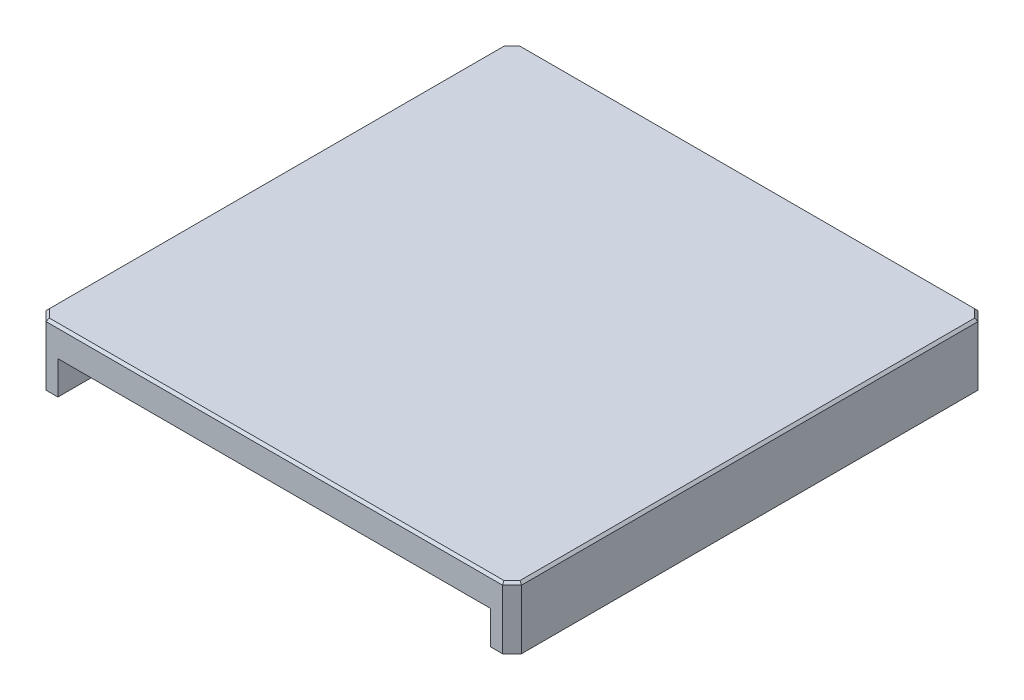
ISO-10303-21;
HEADER;
FILE_DESCRIPTION(('STEP AP214'),'2;1');
FILE_NAME('part.step','',(''),(''),'','','');
FILE_SCHEMA(('AUTOMOTIVE_DESIGN { 1 0 10303 214 1 1 1 1 }'));
ENDSEC;
DATA;
#1=APPLICATION_CONTEXT('core data for automotive mechanical design processes');
#2=APPLICATION_PROTOCOL_DEFINITION('international standard','automotive_design',2000,#1);
#3=PRODUCT_CONTEXT('',#1,'mechanical');
#4=PRODUCT('Part','Part','',(#3));
#5=PRODUCT_RELATED_PRODUCT_CATEGORY('part','',(#4));
#6=PRODUCT_DEFINITION_FORMATION('','',#4);
#7=PRODUCT_DEFINITION_CONTEXT('part definition',#1,'design');
#8=PRODUCT_DEFINITION('design','',#6,#7);
#9=PRODUCT_DEFINITION_SHAPE('','',#8);
#10=(LENGTH_UNIT() NAMED_UNIT(*) SI_UNIT(.MILLI.,.METRE.));
#11=(NAMED_UNIT(*) PLANE_ANGLE_UNIT() SI_UNIT($,.RADIAN.));
#12=(NAMED_UNIT(*) SI_UNIT($,.STERADIAN.) SOLID_ANGLE_UNIT());
#13=UNCERTAINTY_MEASURE_WITH_UNIT(LENGTH_MEASURE(1.E-05),#10,'distance_accuracy_value','');
#14=(GEOMETRIC_REPRESENTATION_CONTEXT(3) GLOBAL_UNCERTAINTY_ASSIGNED_CONTEXT((#13)) GLOBAL_UNIT_ASSIGNED_CONTEXT((#10,
#11,#12)) REPRESENTATION_CONTEXT('',''));
#15=CARTESIAN_POINT('',(0.,0.,0.));
#16=DIRECTION('',(0.,0.,1.));
#17=DIRECTION('',(1.,0.,0.));
#18=AXIS2_PLACEMENT_3D('',#15,#16,#17);
#19=CARTESIAN_POINT('',(50.,13.,100.));
#20=DIRECTION('',(0.,-1.,0.));
#21=DIRECTION('',(1.,0.,0.));
#22=AXIS2_PLACEMENT_3D('',#19,#20,#21);
#23=PLANE('',#22);
#24=DIRECTION('',(0.,0.,-1.));
#25=VECTOR('',#24,1.);
#26=CARTESIAN_POINT('',(49.5,13.,100.));
#27=LINE('',#26,#25);
#28=CARTESIAN_POINT('',(49.5,13.,97.7928932188135));
#29=VERTEX_POINT('',#28);
#30=CARTESIAN_POINT('',(49.5,13.,2.20710678118659));
#31=VERTEX_POINT('',#30);
#32=EDGE_CURVE('E289',#29,#31,#27,.T.);
#33=ORIENTED_EDGE('',*,*,#32,.T.);
#34=DIRECTION('',(-0.70710678118655,0.,-0.707106781186545));
#35=VECTOR('',#34,1.);
#36=CARTESIAN_POINT('',(47.6464466094067,13.,0.353553390593288));
#37=LINE('',#36,#35);
#38=CARTESIAN_POINT('',(47.7928932188134,13.,0.499999999999987));
#39=VERTEX_POINT('',#38);
#40=EDGE_CURVE('E292',#31,#39,#37,.T.);
#41=ORIENTED_EDGE('',*,*,#40,.T.);
#42=DIRECTION('',(-1.,0.,0.));
#43=VECTOR('',#42,1.);
#44=CARTESIAN_POINT('',(-48.,13.,0.499999999999987));
#45=LINE('',#44,#43);
#46=CARTESIAN_POINT('',(-47.7928932188134,13.,0.499999999999987));
#47=VERTEX_POINT('',#46);
#48=EDGE_CURVE('E271',#39,#47,#45,.T.);
#49=ORIENTED_EDGE('',*,*,#48,.T.);
#50=DIRECTION('',(-0.70710678118655,0.,0.707106781186545));
#51=VECTOR('',#50,1.);
#52=CARTESIAN_POINT('',(-49.6464466094067,13.,2.35355339059329));
#53=LINE('',#52,#51);
#54=CARTESIAN_POINT('',(-49.5,13.,2.20710678118659));
#55=VERTEX_POINT('',#54);
#56=EDGE_CURVE('E274',#47,#55,#53,.T.);
#57=ORIENTED_EDGE('',*,*,#56,.T.);
#58=DIRECTION('',(0.,0.,1.));
#59=VECTOR('',#58,1.);
#60=CARTESIAN_POINT('',(-49.5,13.,100.));
#61=LINE('',#60,#59);
#62=CARTESIAN_POINT('',(-49.5,13.,97.7928932188135));
#63=VERTEX_POINT('',#62);
#64=EDGE_CURVE('E277',#55,#63,#61,.T.);
#65=ORIENTED_EDGE('',*,*,#64,.T.);
#66=DIRECTION('',(0.707106781186548,0.,0.707106781186548));
#67=VECTOR('',#66,1.);
#68=CARTESIAN_POINT('',(-47.6464466094068,13.,99.6464466094068));
#69=LINE('',#68,#67);
#70=CARTESIAN_POINT('',(-47.7928932188135,13.,99.5));
#71=VERTEX_POINT('',#70);
#72=EDGE_CURVE('E280',#63,#71,#69,.T.);
#73=ORIENTED_EDGE('',*,*,#72,.T.);
#74=DIRECTION('',(1.,0.,0.));
#75=VECTOR('',#74,1.);
#76=CARTESIAN_POINT('',(50.,13.,99.5));
#77=LINE('',#76,#75);
#78=CARTESIAN_POINT('',(47.7928932188135,13.,99.5));
#79=VERTEX_POINT('',#78);
#80=EDGE_CURVE('E283',#71,#79,#77,.T.);
#81=ORIENTED_EDGE('',*,*,#80,.T.);
#82=DIRECTION('',(0.707106781186548,0.,-0.707106781186548));
#83=VECTOR('',#82,1.);
#84=CARTESIAN_POINT('',(49.6464466094067,13.,97.6464466094068));
#85=LINE('',#84,#83);
#86=EDGE_CURVE('E286',#79,#29,#85,.T.);
#87=ORIENTED_EDGE('',*,*,#86,.T.);
#88=EDGE_LOOP('',(#33,#41,#49,#57,#65,#73,#81,#87));
#89=FACE_BOUND('',#88,.T.);
#90=ADVANCED_FACE('F47',(#89),#23,.F.);
#91=CARTESIAN_POINT('',(-50.,0.,100.));
#92=DIRECTION('',(1.,0.,0.));
#93=DIRECTION('',(0.,0.,-1.));
#94=AXIS2_PLACEMENT_3D('',#91,#92,#93);
#95=PLANE('',#94);
#96=DIRECTION('',(0.,1.,0.));
#97=VECTOR('',#96,1.);
#98=CARTESIAN_POINT('',(-50.,0.,98.));
#99=LINE('',#98,#97);
#100=CARTESIAN_POINT('',(-50.,0.,98.));
#101=VERTEX_POINT('',#100);
#102=CARTESIAN_POINT('',(-50.,12.5,98.));
#103=VERTEX_POINT('',#102);
#104=EDGE_CURVE('E235',#101,#103,#99,.T.);
#105=ORIENTED_EDGE('',*,*,#104,.T.);
#106=DIRECTION('',(0.,0.,-1.));
#107=VECTOR('',#106,1.);
#108=CARTESIAN_POINT('',(-50.,12.5,100.));
#109=LINE('',#108,#107);
#110=CARTESIAN_POINT('',(-50.,12.5,2.));
#111=VERTEX_POINT('',#110);
#112=EDGE_CURVE('E73',#103,#111,#109,.T.);
#113=ORIENTED_EDGE('',*,*,#112,.T.);
#114=DIRECTION('',(0.,-1.,0.));
#115=VECTOR('',#114,1.);
#116=CARTESIAN_POINT('',(-50.,0.,2.));
#117=LINE('',#116,#115);
#118=CARTESIAN_POINT('',(-50.,0.,2.));
#119=VERTEX_POINT('',#118);
#120=EDGE_CURVE('E238',#111,#119,#117,.T.);
#121=ORIENTED_EDGE('',*,*,#120,.T.);
#122=DIRECTION('',(0.,0.,-1.));
#123=VECTOR('',#122,1.);
#124=CARTESIAN_POINT('',(-50.,0.,100.));
#125=LINE('',#124,#123);
#126=EDGE_CURVE('E186',#101,#119,#125,.T.);
#127=ORIENTED_EDGE('',*,*,#126,.F.);
#128=EDGE_LOOP('',(#105,#113,#121,#127));
#129=FACE_BOUND('',#128,.T.);
#130=ADVANCED_FACE('F358',(#129),#95,.F.);
#131=CARTESIAN_POINT('',(-45.5,0.,100.));
#132=DIRECTION('',(0.,1.,0.));
#133=DIRECTION('',(0.,0.,1.));
#134=AXIS2_PLACEMENT_3D('',#131,#132,#133);
#135=PLANE('',#134);
#136=ORIENTED_EDGE('',*,*,#126,.T.);
#137=DIRECTION('',(0.70710678118655,0.,-0.707106781186545));
#138=VECTOR('',#137,1.);
#139=CARTESIAN_POINT('',(-50.,0.,2.));
#140=LINE('',#139,#138);
#141=CARTESIAN_POINT('',(-48.,0.,0.));
#142=VERTEX_POINT('',#141);
#143=EDGE_CURVE('E244',#119,#142,#140,.T.);
#144=ORIENTED_EDGE('',*,*,#143,.T.);
#145=DIRECTION('',(1.,0.,0.));
#146=VECTOR('',#145,1.);
#147=CARTESIAN_POINT('',(-45.5,0.,0.));
#148=LINE('',#147,#146);
#149=CARTESIAN_POINT('',(-45.5,0.,0.));
#150=VERTEX_POINT('',#149);
#151=EDGE_CURVE('E182',#142,#150,#148,.T.);
#152=ORIENTED_EDGE('',*,*,#151,.T.);
#153=DIRECTION('',(0.,0.,-1.));
#154=VECTOR('',#153,1.);
#155=CARTESIAN_POINT('',(-45.5,0.,100.));
#156=LINE('',#155,#154);
#157=CARTESIAN_POINT('',(-45.5,0.,100.));
#158=VERTEX_POINT('',#157);
#159=EDGE_CURVE('E178',#158,#150,#156,.T.);
#160=ORIENTED_EDGE('',*,*,#159,.F.);
#161=DIRECTION('',(1.,0.,0.));
#162=VECTOR('',#161,1.);
#163=CARTESIAN_POINT('',(-45.5,0.,100.));
#164=LINE('',#163,#162);
#165=CARTESIAN_POINT('',(-48.,0.,100.));
#166=VERTEX_POINT('',#165);
#167=EDGE_CURVE('E163',#166,#158,#164,.T.);
#168=ORIENTED_EDGE('',*,*,#167,.F.);
#169=DIRECTION('',(0.707106781186548,0.,0.707106781186548));
#170=VECTOR('',#169,1.);
#171=CARTESIAN_POINT('',(-48.,0.,100.));
#172=LINE('',#171,#170);
#173=EDGE_CURVE('E241',#166,#101,#172,.F.);
#174=ORIENTED_EDGE('',*,*,#173,.T.);
#175=EDGE_LOOP('',(#136,#144,#152,#160,#168,#174));
#176=FACE_BOUND('',#175,.T.);
#177=ADVANCED_FACE('F180',(#176),#135,.F.);
#178=CARTESIAN_POINT('',(-45.5,7.,100.));
#179=DIRECTION('',(-1.,0.,0.));
#180=DIRECTION('',(0.,0.,1.));
#181=AXIS2_PLACEMENT_3D('',#178,#179,#180);
#182=PLANE('',#181);
#183=DIRECTION('',(0.,1.,0.));
#184=VECTOR('',#183,1.);
#185=CARTESIAN_POINT('',(-45.5,7.,0.));
#186=LINE('',#185,#184);
#187=CARTESIAN_POINT('',(-45.5,7.,0.));
#188=VERTEX_POINT('',#187);
#189=EDGE_CURVE('E208',#150,#188,#186,.T.);
#190=ORIENTED_EDGE('',*,*,#189,.T.);
#191=DIRECTION('',(0.,0.,-1.));
#192=VECTOR('',#191,1.);
#193=CARTESIAN_POINT('',(-45.5,7.,100.));
#194=LINE('',#193,#192);
#195=CARTESIAN_POINT('',(-45.5,7.,100.));
#196=VERTEX_POINT('',#195);
#197=EDGE_CURVE('E187',#196,#188,#194,.T.);
#198=ORIENTED_EDGE('',*,*,#197,.F.);
#199=DIRECTION('',(0.,1.,0.));
#200=VECTOR('',#199,1.);
#201=CARTESIAN_POINT('',(-45.5,7.,100.));
#202=LINE('',#201,#200);
#203=EDGE_CURVE('E168',#158,#196,#202,.T.);
#204=ORIENTED_EDGE('',*,*,#203,.F.);
#205=ORIENTED_EDGE('',*,*,#159,.T.);
#206=EDGE_LOOP('',(#190,#198,#204,#205));
#207=FACE_BOUND('',#206,.T.);
#208=ADVANCED_FACE('F189',(#207),#182,.F.);
#209=CARTESIAN_POINT('',(-45.5,7.,100.));
#210=DIRECTION('',(0.,1.,0.));
#211=DIRECTION('',(-1.,0.,0.));
#212=AXIS2_PLACEMENT_3D('',#209,#210,#211);
#213=PLANE('',#212);
#214=DIRECTION('',(1.,0.,0.));
#215=VECTOR('',#214,1.);
#216=CARTESIAN_POINT('',(-45.5,7.,0.));
#217=LINE('',#216,#215);
#218=CARTESIAN_POINT('',(45.5,7.,0.));
#219=VERTEX_POINT('',#218);
#220=EDGE_CURVE('E211',#188,#219,#217,.T.);
#221=ORIENTED_EDGE('',*,*,#220,.T.);
#222=DIRECTION('',(0.,0.,-1.));
#223=VECTOR('',#222,1.);
#224=CARTESIAN_POINT('',(45.5,7.,100.));
#225=LINE('',#224,#223);
#226=CARTESIAN_POINT('',(45.5,7.,100.));
#227=VERTEX_POINT('',#226);
#228=EDGE_CURVE('E227',#227,#219,#225,.T.);
#229=ORIENTED_EDGE('',*,*,#228,.F.);
#230=DIRECTION('',(1.,0.,0.));
#231=VECTOR('',#230,1.);
#232=CARTESIAN_POINT('',(-45.5,7.,100.));
#233=LINE('',#232,#231);
#234=EDGE_CURVE('E193',#196,#227,#233,.T.);
#235=ORIENTED_EDGE('',*,*,#234,.F.);
#236=ORIENTED_EDGE('',*,*,#197,.T.);
#237=EDGE_LOOP('',(#221,#229,#235,#236));
#238=FACE_BOUND('',#237,.T.);
#239=ADVANCED_FACE('F391',(#238),#213,.F.);
#240=CARTESIAN_POINT('',(45.5,7.,100.));
#241=DIRECTION('',(1.,0.,0.));
#242=DIRECTION('',(0.,0.,-1.));
#243=AXIS2_PLACEMENT_3D('',#240,#241,#242);
#244=PLANE('',#243);
#245=DIRECTION('',(0.,-1.,0.));
#246=VECTOR('',#245,1.);
#247=CARTESIAN_POINT('',(45.5,7.,0.));
#248=LINE('',#247,#246);
#249=CARTESIAN_POINT('',(45.5,0.,0.));
#250=VERTEX_POINT('',#249);
#251=EDGE_CURVE('E214',#219,#250,#248,.T.);
#252=ORIENTED_EDGE('',*,*,#251,.T.);
#253=DIRECTION('',(0.,0.,-1.));
#254=VECTOR('',#253,1.);
#255=CARTESIAN_POINT('',(45.5,0.,100.));
#256=LINE('',#255,#254);
#257=CARTESIAN_POINT('',(45.5,0.,100.));
#258=VERTEX_POINT('',#257);
#259=EDGE_CURVE('E223',#258,#250,#256,.T.);
#260=ORIENTED_EDGE('',*,*,#259,.F.);
#261=DIRECTION('',(0.,-1.,0.));
#262=VECTOR('',#261,1.);
#263=CARTESIAN_POINT('',(45.5,7.,100.));
#264=LINE('',#263,#262);
#265=EDGE_CURVE('E196',#227,#258,#264,.T.);
#266=ORIENTED_EDGE('',*,*,#265,.F.);
#267=ORIENTED_EDGE('',*,*,#228,.T.);
#268=EDGE_LOOP('',(#252,#260,#266,#267));
#269=FACE_BOUND('',#268,.T.);
#270=ADVANCED_FACE('F394',(#269),#244,.F.);
#271=CARTESIAN_POINT('',(45.5,0.,100.));
#272=DIRECTION('',(0.,1.,0.));
#273=DIRECTION('',(0.,0.,1.));
#274=AXIS2_PLACEMENT_3D('',#271,#272,#273);
#275=PLANE('',#274);
#276=DIRECTION('',(1.,0.,0.));
#277=VECTOR('',#276,1.);
#278=CARTESIAN_POINT('',(45.5,0.,0.));
#279=LINE('',#278,#277);
#280=CARTESIAN_POINT('',(48.,0.,0.));
#281=VERTEX_POINT('',#280);
#282=EDGE_CURVE('E175',#250,#281,#279,.T.);
#283=ORIENTED_EDGE('',*,*,#282,.T.);
#284=DIRECTION('',(0.70710678118655,0.,0.707106781186545));
#285=VECTOR('',#284,1.);
#286=CARTESIAN_POINT('',(50.,0.,2.));
#287=LINE('',#286,#285);
#288=CARTESIAN_POINT('',(50.,0.,2.));
#289=VERTEX_POINT('',#288);
#290=EDGE_CURVE('E263',#281,#289,#287,.T.);
#291=ORIENTED_EDGE('',*,*,#290,.T.);
#292=DIRECTION('',(0.,0.,-1.));
#293=VECTOR('',#292,1.);
#294=CARTESIAN_POINT('',(50.,0.,100.));
#295=LINE('',#294,#293);
#296=CARTESIAN_POINT('',(50.,0.,98.));
#297=VERTEX_POINT('',#296);
#298=EDGE_CURVE('E205',#297,#289,#295,.T.);
#299=ORIENTED_EDGE('',*,*,#298,.F.);
#300=DIRECTION('',(0.707106781186548,0.,-0.707106781186548));
#301=VECTOR('',#300,1.);
#302=CARTESIAN_POINT('',(48.,0.,100.));
#303=LINE('',#302,#301);
#304=CARTESIAN_POINT('',(48.,0.,100.));
#305=VERTEX_POINT('',#304);
#306=EDGE_CURVE('E260',#297,#305,#303,.F.);
#307=ORIENTED_EDGE('',*,*,#306,.T.);
#308=DIRECTION('',(1.,0.,0.));
#309=VECTOR('',#308,1.);
#310=CARTESIAN_POINT('',(45.5,0.,100.));
#311=LINE('',#310,#309);
#312=EDGE_CURVE('E201',#258,#305,#311,.T.);
#313=ORIENTED_EDGE('',*,*,#312,.F.);
#314=ORIENTED_EDGE('',*,*,#259,.T.);
#315=EDGE_LOOP('',(#283,#291,#299,#307,#313,#314));
#316=FACE_BOUND('',#315,.T.);
#317=ADVANCED_FACE('F398',(#316),#275,.F.);
#318=CARTESIAN_POINT('',(50.,0.,100.));
#319=DIRECTION('',(-1.,0.,0.));
#320=DIRECTION('',(0.,0.,1.));
#321=AXIS2_PLACEMENT_3D('',#318,#319,#320);
#322=PLANE('',#321);
#323=DIRECTION('',(0.,1.,0.));
#324=VECTOR('',#323,1.);
#325=CARTESIAN_POINT('',(50.,13.,2.));
#326=LINE('',#325,#324);
#327=CARTESIAN_POINT('',(50.,12.5,2.));
#328=VERTEX_POINT('',#327);
#329=EDGE_CURVE('E256',#289,#328,#326,.T.);
#330=ORIENTED_EDGE('',*,*,#329,.T.);
#331=DIRECTION('',(0.,0.,1.));
#332=VECTOR('',#331,1.);
#333=CARTESIAN_POINT('',(50.,12.5,100.));
#334=LINE('',#333,#332);
#335=CARTESIAN_POINT('',(50.,12.5,98.));
#336=VERTEX_POINT('',#335);
#337=EDGE_CURVE('E300',#328,#336,#334,.T.);
#338=ORIENTED_EDGE('',*,*,#337,.T.);
#339=DIRECTION('',(0.,-1.,0.));
#340=VECTOR('',#339,1.);
#341=CARTESIAN_POINT('',(50.,0.,98.));
#342=LINE('',#341,#340);
#343=EDGE_CURVE('E253',#336,#297,#342,.T.);
#344=ORIENTED_EDGE('',*,*,#343,.T.);
#345=ORIENTED_EDGE('',*,*,#298,.T.);
#346=EDGE_LOOP('',(#330,#338,#344,#345));
#347=FACE_BOUND('',#346,.T.);
#348=ADVANCED_FACE('F401',(#347),#322,.F.);
#349=CARTESIAN_POINT('',(0.,0.,100.));
#350=DIRECTION('',(0.,0.,-1.));
#351=DIRECTION('',(-1.,0.,0.));
#352=AXIS2_PLACEMENT_3D('',#349,#350,#351);
#353=PLANE('',#352);
#354=DIRECTION('',(0.,1.,0.));
#355=VECTOR('',#354,1.);
#356=CARTESIAN_POINT('',(48.,0.,100.));
#357=LINE('',#356,#355);
#358=CARTESIAN_POINT('',(48.,12.5,100.));
#359=VERTEX_POINT('',#358);
#360=EDGE_CURVE('E268',#305,#359,#357,.T.);
#361=ORIENTED_EDGE('',*,*,#360,.T.);
#362=DIRECTION('',(-1.,0.,0.));
#363=VECTOR('',#362,1.);
#364=CARTESIAN_POINT('',(0.,12.5,100.));
#365=LINE('',#364,#363);
#366=CARTESIAN_POINT('',(-48.,12.5,100.));
#367=VERTEX_POINT('',#366);
#368=EDGE_CURVE('E306',#359,#367,#365,.T.);
#369=ORIENTED_EDGE('',*,*,#368,.T.);
#370=DIRECTION('',(0.,-1.,0.));
#371=VECTOR('',#370,1.);
#372=CARTESIAN_POINT('',(-48.,0.,100.));
#373=LINE('',#372,#371);
#374=EDGE_CURVE('E171',#367,#166,#373,.T.);
#375=ORIENTED_EDGE('',*,*,#374,.T.);
#376=ORIENTED_EDGE('',*,*,#167,.T.);
#377=ORIENTED_EDGE('',*,*,#203,.T.);
#378=ORIENTED_EDGE('',*,*,#234,.T.);
#379=ORIENTED_EDGE('',*,*,#265,.T.);
#380=ORIENTED_EDGE('',*,*,#312,.T.);
#381=EDGE_LOOP('',(#361,#369,#375,#376,#377,#378,#379,#380));
#382=FACE_BOUND('',#381,.T.);
#383=ADVANCED_FACE('F166',(#382),#353,.F.);
#384=CARTESIAN_POINT('',(0.,0.,0.));
#385=DIRECTION('',(0.,0.,-1.));
#386=DIRECTION('',(-1.,0.,0.));
#387=AXIS2_PLACEMENT_3D('',#384,#385,#386);
#388=PLANE('',#387);
#389=DIRECTION('',(0.,1.,0.));
#390=VECTOR('',#389,1.);
#391=CARTESIAN_POINT('',(-48.,13.,0.));
#392=LINE('',#391,#390);
#393=CARTESIAN_POINT('',(-48.,12.5,0.));
#394=VERTEX_POINT('',#393);
#395=EDGE_CURVE('E250',#142,#394,#392,.T.);
#396=ORIENTED_EDGE('',*,*,#395,.T.);
#397=DIRECTION('',(1.,0.,0.));
#398=VECTOR('',#397,1.);
#399=CARTESIAN_POINT('',(48.,12.5,0.));
#400=LINE('',#399,#398);
#401=CARTESIAN_POINT('',(48.,12.5,0.));
#402=VERTEX_POINT('',#401);
#403=EDGE_CURVE('E11',#394,#402,#400,.T.);
#404=ORIENTED_EDGE('',*,*,#403,.T.);
#405=DIRECTION('',(0.,-1.,0.));
#406=VECTOR('',#405,1.);
#407=CARTESIAN_POINT('',(48.,0.,0.));
#408=LINE('',#407,#406);
#409=EDGE_CURVE('E247',#402,#281,#408,.T.);
#410=ORIENTED_EDGE('',*,*,#409,.T.);
#411=ORIENTED_EDGE('',*,*,#282,.F.);
#412=ORIENTED_EDGE('',*,*,#251,.F.);
#413=ORIENTED_EDGE('',*,*,#220,.F.);
#414=ORIENTED_EDGE('',*,*,#189,.F.);
#415=ORIENTED_EDGE('',*,*,#151,.F.);
#416=EDGE_LOOP('',(#396,#404,#410,#411,#412,#413,#414,#415));
#417=FACE_BOUND('',#416,.T.);
#418=ADVANCED_FACE('F361',(#417),#388,.T.);
#419=CARTESIAN_POINT('',(-50.,0.,2.));
#420=DIRECTION('',(-0.707106781186545,0.,-0.70710678118655));
#421=DIRECTION('',(0.,1.,0.));
#422=AXIS2_PLACEMENT_3D('',#419,#420,#421);
#423=PLANE('',#422);
#424=ORIENTED_EDGE('',*,*,#120,.F.);
#425=DIRECTION('',(0.70710678118655,0.,-0.707106781186545));
#426=VECTOR('',#425,1.);
#427=CARTESIAN_POINT('',(-48.,12.5,0.));
#428=LINE('',#427,#426);
#429=EDGE_CURVE('E58',#111,#394,#428,.T.);
#430=ORIENTED_EDGE('',*,*,#429,.T.);
#431=ORIENTED_EDGE('',*,*,#395,.F.);
#432=ORIENTED_EDGE('',*,*,#143,.F.);
#433=EDGE_LOOP('',(#424,#430,#431,#432));
#434=FACE_BOUND('',#433,.T.);
#435=ADVANCED_FACE('F364',(#434),#423,.T.);
#436=CARTESIAN_POINT('',(50.,0.,2.));
#437=DIRECTION('',(0.707106781186545,0.,-0.70710678118655));
#438=DIRECTION('',(0.,-1.,0.));
#439=AXIS2_PLACEMENT_3D('',#436,#437,#438);
#440=PLANE('',#439);
#441=ORIENTED_EDGE('',*,*,#409,.F.);
#442=DIRECTION('',(0.70710678118655,0.,0.707106781186545));
#443=VECTOR('',#442,1.);
#444=CARTESIAN_POINT('',(50.,12.5,2.));
#445=LINE('',#444,#443);
#446=EDGE_CURVE('E296',#402,#328,#445,.T.);
#447=ORIENTED_EDGE('',*,*,#446,.T.);
#448=ORIENTED_EDGE('',*,*,#329,.F.);
#449=ORIENTED_EDGE('',*,*,#290,.F.);
#450=EDGE_LOOP('',(#441,#447,#448,#449));
#451=FACE_BOUND('',#450,.T.);
#452=ADVANCED_FACE('F367',(#451),#440,.T.);
#453=CARTESIAN_POINT('',(48.,0.,100.));
#454=DIRECTION('',(-0.707106781186547,0.,-0.707106781186547));
#455=DIRECTION('',(0.,1.,0.));
#456=AXIS2_PLACEMENT_3D('',#453,#454,#455);
#457=PLANE('',#456);
#458=ORIENTED_EDGE('',*,*,#343,.F.);
#459=DIRECTION('',(0.707106781186548,0.,-0.707106781186548));
#460=VECTOR('',#459,1.);
#461=CARTESIAN_POINT('',(48.,12.5,100.));
#462=LINE('',#461,#460);
#463=EDGE_CURVE('E303',#336,#359,#462,.F.);
#464=ORIENTED_EDGE('',*,*,#463,.T.);
#465=ORIENTED_EDGE('',*,*,#360,.F.);
#466=ORIENTED_EDGE('',*,*,#306,.F.);
#467=EDGE_LOOP('',(#458,#464,#465,#466));
#468=FACE_BOUND('',#467,.T.);
#469=ADVANCED_FACE('F373',(#468),#457,.F.);
#470=CARTESIAN_POINT('',(-48.,0.,100.));
#471=DIRECTION('',(0.707106781186547,0.,-0.707106781186547));
#472=DIRECTION('',(0.,-1.,0.));
#473=AXIS2_PLACEMENT_3D('',#470,#471,#472);
#474=PLANE('',#473);
#475=ORIENTED_EDGE('',*,*,#374,.F.);
#476=DIRECTION('',(0.707106781186548,0.,0.707106781186548));
#477=VECTOR('',#476,1.);
#478=CARTESIAN_POINT('',(-50.,12.5,98.));
#479=LINE('',#478,#477);
#480=EDGE_CURVE('E309',#367,#103,#479,.F.);
#481=ORIENTED_EDGE('',*,*,#480,.T.);
#482=ORIENTED_EDGE('',*,*,#104,.F.);
#483=ORIENTED_EDGE('',*,*,#173,.F.);
#484=EDGE_LOOP('',(#475,#481,#482,#483));
#485=FACE_BOUND('',#484,.T.);
#486=ADVANCED_FACE('F356',(#485),#474,.F.);
#487=CARTESIAN_POINT('',(1.35355339059325,13.,148.646446609407));
#488=DIRECTION('',(0.500000000000014,-0.707106781186528,-0.500000000000014));
#489=DIRECTION('',(0.707106781186548,0.,0.707106781186548));
#490=AXIS2_PLACEMENT_3D('',#487,#488,#489);
#491=PLANE('',#490);
#492=DIRECTION('',(0.678598344545844,0.678598344545862,-0.281084637714792));
#493=VECTOR('',#492,1.);
#494=CARTESIAN_POINT('',(-50.3814871396611,12.1185128603389,98.1580171471185));
#495=LINE('',#494,#493);
#496=EDGE_CURVE('E337',#103,#63,#495,.T.);
#497=ORIENTED_EDGE('',*,*,#496,.F.);
#498=ORIENTED_EDGE('',*,*,#480,.F.);
#499=DIRECTION('',(0.281084637714792,0.678598344545862,-0.678598344545843));
#500=VECTOR('',#499,1.);
#501=CARTESIAN_POINT('',(-53.2842712474617,-0.257359312881853,112.757359312881));
#502=LINE('',#501,#500);
#503=EDGE_CURVE('E52',#71,#367,#502,.F.);
#504=ORIENTED_EDGE('',*,*,#503,.F.);
#505=ORIENTED_EDGE('',*,*,#72,.F.);
#506=EDGE_LOOP('',(#497,#498,#504,#505));
#507=FACE_BOUND('',#506,.T.);
#508=ADVANCED_FACE('F50',(#507),#491,.F.);
#509=CARTESIAN_POINT('',(0.,12.5,100.));
#510=DIRECTION('',(0.,-0.707106781186538,-0.707106781186557));
#511=DIRECTION('',(-1.,0.,0.));
#512=AXIS2_PLACEMENT_3D('',#509,#510,#511);
#513=PLANE('',#512);
#514=ORIENTED_EDGE('',*,*,#503,.T.);
#515=ORIENTED_EDGE('',*,*,#368,.F.);
#516=DIRECTION('',(-0.281084637714811,0.678598344545858,-0.67859834454584));
#517=VECTOR('',#516,1.);
#518=CARTESIAN_POINT('',(44.2075884691552,21.6556913518661,90.8443086481342));
#519=LINE('',#518,#517);
#520=EDGE_CURVE('E334',#79,#359,#519,.F.);
#521=ORIENTED_EDGE('',*,*,#520,.F.);
#522=ORIENTED_EDGE('',*,*,#80,.F.);
#523=EDGE_LOOP('',(#514,#515,#521,#522));
#524=FACE_BOUND('',#523,.T.);
#525=ADVANCED_FACE('F349',(#524),#513,.F.);
#526=CARTESIAN_POINT('',(-50.,12.5,100.));
#527=DIRECTION('',(0.707106781186557,-0.707106781186538,0.));
#528=DIRECTION('',(0.,0.,-1.));
#529=AXIS2_PLACEMENT_3D('',#526,#527,#528);
#530=PLANE('',#529);
#531=ORIENTED_EDGE('',*,*,#496,.T.);
#532=ORIENTED_EDGE('',*,*,#64,.F.);
#533=DIRECTION('',(-0.678598344545825,-0.678598344545844,-0.281084637714882));
#534=VECTOR('',#533,1.);
#535=CARTESIAN_POINT('',(-49.2697521433898,13.2302478566102,2.30247856610191));
#536=LINE('',#535,#534);
#537=EDGE_CURVE('E330',#111,#55,#536,.F.);
#538=ORIENTED_EDGE('',*,*,#537,.F.);
#539=ORIENTED_EDGE('',*,*,#112,.F.);
#540=EDGE_LOOP('',(#531,#532,#538,#539));
#541=FACE_BOUND('',#540,.T.);
#542=ADVANCED_FACE('F460',(#541),#530,.F.);
#543=CARTESIAN_POINT('',(48.6464466094068,13.,98.6464466094068));
#544=DIRECTION('',(-0.500000000000008,-0.707106781186536,-0.500000000000008));
#545=DIRECTION('',(0.707106781186548,0.,-0.707106781186548));
#546=AXIS2_PLACEMENT_3D('',#543,#544,#545);
#547=PLANE('',#546);
#548=ORIENTED_EDGE('',*,*,#520,.T.);
#549=ORIENTED_EDGE('',*,*,#463,.F.);
#550=DIRECTION('',(-0.67859834454584,0.678598344545858,-0.281084637714811));
#551=VECTOR('',#550,1.);
#552=CARTESIAN_POINT('',(49.2697521433898,13.2302478566102,97.6975214338982));
#553=LINE('',#552,#551);
#554=EDGE_CURVE('E326',#29,#336,#553,.F.);
#555=ORIENTED_EDGE('',*,*,#554,.F.);
#556=ORIENTED_EDGE('',*,*,#86,.F.);
#557=EDGE_LOOP('',(#548,#549,#555,#556));
#558=FACE_BOUND('',#557,.T.);
#559=ADVANCED_FACE('F468',(#558),#547,.F.);
#560=CARTESIAN_POINT('',(-48.6464466094064,13.,1.35355339059295));
#561=DIRECTION('',(-0.499999999999987,0.707106781186563,-0.499999999999991));
#562=DIRECTION('',(0.70710678118655,0.,-0.707106781186545));
#563=AXIS2_PLACEMENT_3D('',#560,#561,#562);
#564=PLANE('',#563);
#565=ORIENTED_EDGE('',*,*,#537,.T.);
#566=ORIENTED_EDGE('',*,*,#56,.F.);
#567=DIRECTION('',(0.281084637714879,0.678598344545844,0.678598344545825));
#568=VECTOR('',#567,1.);
#569=CARTESIAN_POINT('',(-40.0664162213575,31.6533655566177,19.1533655566172));
#570=LINE('',#569,#568);
#571=EDGE_CURVE('E322',#394,#47,#570,.T.);
#572=ORIENTED_EDGE('',*,*,#571,.F.);
#573=ORIENTED_EDGE('',*,*,#429,.F.);
#574=EDGE_LOOP('',(#565,#566,#572,#573));
#575=FACE_BOUND('',#574,.T.);
#576=ADVANCED_FACE('F477',(#575),#564,.T.);
#577=CARTESIAN_POINT('',(49.5,13.,100.));
#578=DIRECTION('',(-0.707106781186557,-0.707106781186538,0.));
#579=DIRECTION('',(0.,0.,-1.));
#580=AXIS2_PLACEMENT_3D('',#577,#578,#579);
#581=PLANE('',#580);
#582=ORIENTED_EDGE('',*,*,#554,.T.);
#583=ORIENTED_EDGE('',*,*,#337,.F.);
#584=DIRECTION('',(0.678598344545828,-0.678598344545847,-0.281084637714867));
#585=VECTOR('',#584,1.);
#586=CARTESIAN_POINT('',(30.8466344433836,31.653365556617,9.93358377864177));
#587=LINE('',#586,#585);
#588=EDGE_CURVE('E319',#31,#328,#587,.T.);
#589=ORIENTED_EDGE('',*,*,#588,.F.);
#590=ORIENTED_EDGE('',*,*,#32,.F.);
#591=EDGE_LOOP('',(#582,#583,#589,#590));
#592=FACE_BOUND('',#591,.T.);
#593=ADVANCED_FACE('F487',(#592),#581,.F.);
#594=CARTESIAN_POINT('',(50.,13.,0.499999999999987));
#595=DIRECTION('',(0.,0.707106781186538,-0.707106781186557));
#596=DIRECTION('',(1.,0.,0.));
#597=AXIS2_PLACEMENT_3D('',#594,#595,#596);
#598=PLANE('',#597);
#599=ORIENTED_EDGE('',*,*,#571,.T.);
#600=ORIENTED_EDGE('',*,*,#48,.F.);
#601=DIRECTION('',(0.281084637714864,-0.678598344545847,-0.678598344545829));
#602=VECTOR('',#601,1.);
#603=CARTESIAN_POINT('',(47.967273577288,12.5790085735592,0.0790085735591943));
#604=LINE('',#603,#602);
#605=EDGE_CURVE('E316',#402,#39,#604,.F.);
#606=ORIENTED_EDGE('',*,*,#605,.F.);
#607=ORIENTED_EDGE('',*,*,#403,.F.);
#608=EDGE_LOOP('',(#599,#600,#606,#607));
#609=FACE_BOUND('',#608,.T.);
#610=ADVANCED_FACE('F497',(#609),#598,.T.);
#611=CARTESIAN_POINT('',(98.6464466094067,13.,51.3535533905929));
#612=DIRECTION('',(0.499999999999991,0.707106781186557,-0.499999999999995));
#613=DIRECTION('',(0.70710678118655,0.,0.707106781186545));
#614=AXIS2_PLACEMENT_3D('',#611,#612,#613);
#615=PLANE('',#614);
#616=ORIENTED_EDGE('',*,*,#588,.T.);
#617=ORIENTED_EDGE('',*,*,#446,.F.);
#618=ORIENTED_EDGE('',*,*,#605,.T.);
#619=ORIENTED_EDGE('',*,*,#40,.F.);
#620=EDGE_LOOP('',(#616,#617,#618,#619));
#621=FACE_BOUND('',#620,.T.);
#622=ADVANCED_FACE('F507',(#621),#615,.T.);
#623=CLOSED_SHELL('',(#90,#130,#177,#208,#239,#270,#317,#348,#383,#418,#435,#452,#469,#486,#508,
#525,#542,#559,#576,#593,#610,#622));
#624=MANIFOLD_SOLID_BREP('B2',#623);
#625=ADVANCED_BREP_SHAPE_REPRESENTATION('',(#18,#624),#14);
#626=SHAPE_DEFINITION_REPRESENTATION(#9,#625);
ENDSEC;
END-ISO-10303-21;
